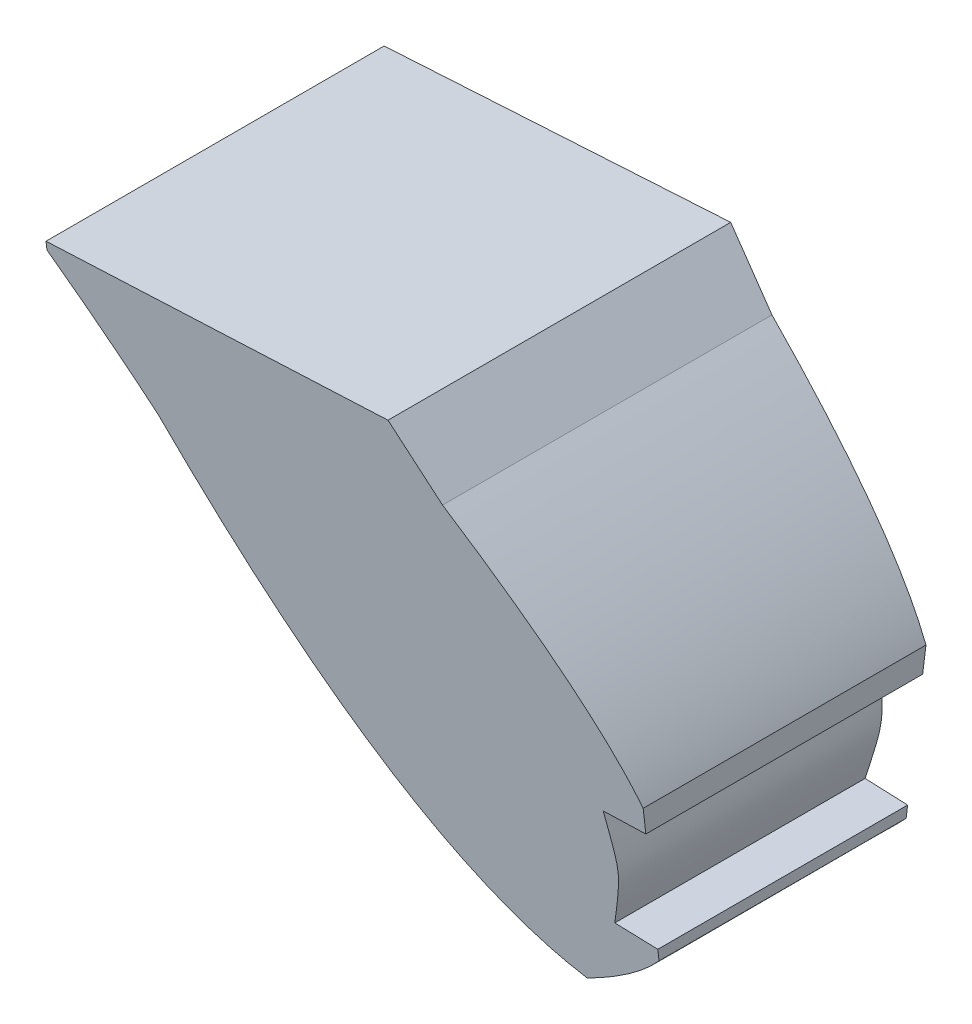
ISO-10303-21;
HEADER;
FILE_DESCRIPTION(('STEP AP214'),'2;1');
FILE_NAME('part.step','',(''),(''),'','','');
FILE_SCHEMA(('AUTOMOTIVE_DESIGN { 1 0 10303 214 1 1 1 1 }'));
ENDSEC;
DATA;
#1=APPLICATION_CONTEXT('core data for automotive mechanical design processes');
#2=APPLICATION_PROTOCOL_DEFINITION('international standard','automotive_design',2000,#1);
#3=PRODUCT_CONTEXT('',#1,'mechanical');
#4=PRODUCT('Part','Part','',(#3));
#5=PRODUCT_RELATED_PRODUCT_CATEGORY('part','',(#4));
#6=PRODUCT_DEFINITION_FORMATION('','',#4);
#7=PRODUCT_DEFINITION_CONTEXT('part definition',#1,'design');
#8=PRODUCT_DEFINITION('design','',#6,#7);
#9=PRODUCT_DEFINITION_SHAPE('','',#8);
#10=(LENGTH_UNIT() NAMED_UNIT(*) SI_UNIT(.MILLI.,.METRE.));
#11=(NAMED_UNIT(*) PLANE_ANGLE_UNIT() SI_UNIT($,.RADIAN.));
#12=(NAMED_UNIT(*) SI_UNIT($,.STERADIAN.) SOLID_ANGLE_UNIT());
#13=UNCERTAINTY_MEASURE_WITH_UNIT(LENGTH_MEASURE(1.E-05),#10,'distance_accuracy_value','');
#14=(GEOMETRIC_REPRESENTATION_CONTEXT(3) GLOBAL_UNCERTAINTY_ASSIGNED_CONTEXT((#13)) GLOBAL_UNIT_ASSIGNED_CONTEXT((#10,
#11,#12)) REPRESENTATION_CONTEXT('',''));
#15=CARTESIAN_POINT('',(0.,0.,0.));
#16=DIRECTION('',(0.,0.,1.));
#17=DIRECTION('',(1.,0.,0.));
#18=AXIS2_PLACEMENT_3D('',#15,#16,#17);
#19=CARTESIAN_POINT('',(0.355125000055651,-1.23774703808888E-13,7.));
#20=DIRECTION('',(-1.,3.48538412642003E-13,0.));
#21=DIRECTION('',(-3.48538412642003E-13,-1.,0.));
#22=AXIS2_PLACEMENT_3D('',#19,#20,#21);
#23=PLANE('',#22);
#24=DIRECTION('',(0.,-0.99013607461042,0.140109078060878));
#25=VECTOR('',#24,1.);
#26=CARTESIAN_POINT('',(0.355125000056697,12.6081551722012,-7.));
#27=LINE('',#26,#25);
#28=CARTESIAN_POINT('',(0.355125000056697,3.0015495286345,-5.64061850231631));
#29=VERTEX_POINT('',#28);
#30=CARTESIAN_POINT('',(0.355125000056447,2.03738091179555,-5.50418394603202));
#31=VERTEX_POINT('',#30);
#32=EDGE_CURVE('E56',#29,#31,#27,.T.);
#33=ORIENTED_EDGE('',*,*,#32,.F.);
#34=DIRECTION('',(0.,0.,-1.));
#35=VECTOR('',#34,1.);
#36=CARTESIAN_POINT('',(0.355125000056697,3.0015495286345,7.));
#37=LINE('',#36,#35);
#38=CARTESIAN_POINT('',(0.355125000056697,3.0015495286345,5.91249480185305));
#39=VERTEX_POINT('',#38);
#40=EDGE_CURVE('E177',#39,#29,#37,.T.);
#41=ORIENTED_EDGE('',*,*,#40,.F.);
#42=DIRECTION('',(0.,0.993653373689782,0.112485434412263));
#43=VECTOR('',#42,1.);
#44=CARTESIAN_POINT('',(0.355125000056697,12.6081551722012,7.));
#45=LINE('',#44,#43);
#46=CARTESIAN_POINT('',(0.355125000056697,2.03738091179556,5.80334715682562));
#47=VERTEX_POINT('',#46);
#48=EDGE_CURVE('E155',#47,#39,#45,.T.);
#49=ORIENTED_EDGE('',*,*,#48,.F.);
#50=DIRECTION('',(0.,0.,-1.));
#51=VECTOR('',#50,1.);
#52=CARTESIAN_POINT('',(0.355125000056447,2.03738091179555,7.));
#53=LINE('',#52,#51);
#54=EDGE_CURVE('E168',#47,#31,#53,.T.);
#55=ORIENTED_EDGE('',*,*,#54,.T.);
#56=EDGE_LOOP('',(#33,#41,#49,#55));
#57=FACE_BOUND('',#56,.T.);
#58=ADVANCED_FACE('F45',(#57),#23,.F.);
#59=CARTESIAN_POINT('',(-23.0359211456035,0.,7.));
#60=DIRECTION('',(-1.,0.,0.));
#61=DIRECTION('',(0.,0.,1.));
#62=AXIS2_PLACEMENT_3D('',#59,#60,#61);
#63=PLANE('',#62);
#64=DIRECTION('',(0.,0.,-1.));
#65=VECTOR('',#64,1.);
#66=CARTESIAN_POINT('',(-23.0359211456035,11.8716122879342,7.));
#67=LINE('',#66,#65);
#68=CARTESIAN_POINT('',(-23.0359211456035,11.8716122879342,6.91662047501294));
#69=VERTEX_POINT('',#68);
#70=CARTESIAN_POINT('',(-23.0359211456035,11.8716122879342,-6.89577559376618));
#71=VERTEX_POINT('',#70);
#72=EDGE_CURVE('E188',#69,#71,#67,.T.);
#73=ORIENTED_EDGE('',*,*,#72,.T.);
#74=DIRECTION('',(0.,-0.99013607461042,0.140109078060878));
#75=VECTOR('',#74,1.);
#76=CARTESIAN_POINT('',(-23.0359211456035,12.6081551722012,-7.));
#77=LINE('',#76,#75);
#78=CARTESIAN_POINT('',(-23.0359211456035,11.5401378200983,-6.84887034177091));
#79=VERTEX_POINT('',#78);
#80=EDGE_CURVE('E319',#71,#79,#77,.T.);
#81=ORIENTED_EDGE('',*,*,#80,.T.);
#82=DIRECTION('',(0.,0.,-1.));
#83=VECTOR('',#82,1.);
#84=CARTESIAN_POINT('',(-23.0359211456035,11.5401378200983,7.));
#85=LINE('',#84,#83);
#86=CARTESIAN_POINT('',(-23.0359211456035,11.5401378200983,6.87909627341673));
#87=VERTEX_POINT('',#86);
#88=EDGE_CURVE('E195',#87,#79,#85,.T.);
#89=ORIENTED_EDGE('',*,*,#88,.F.);
#90=DIRECTION('',(0.,0.993653373689782,0.112485434412263));
#91=VECTOR('',#90,1.);
#92=CARTESIAN_POINT('',(-23.0359211456035,12.6081551722012,7.));
#93=LINE('',#92,#91);
#94=EDGE_CURVE('E318',#87,#69,#93,.T.);
#95=ORIENTED_EDGE('',*,*,#94,.T.);
#96=EDGE_LOOP('',(#73,#81,#89,#95));
#97=FACE_BOUND('',#96,.T.);
#98=ADVANCED_FACE('F320',(#97),#63,.T.);
#99=CARTESIAN_POINT('',(-18.9451921135982,7.54091889574655,7.));
#100=CARTESIAN_POINT('',(-10.2150083842792,-3.69764410322756,7.));
#101=CARTESIAN_POINT('',(-2.84660482498738,-5.05908110388432,7.));
#102=(BOUNDED_CURVE() B_SPLINE_CURVE(2,(#99,#100,#101),.UNSPECIFIED.,.F.,
.F.) B_SPLINE_CURVE_WITH_KNOTS((3,3),(0.497667241108509,0.499554279588011),
.UNSPECIFIED.) CURVE() GEOMETRIC_REPRESENTATION_ITEM() RATIONAL_B_SPLINE_CURVE((1.,1.,1.)) REPRESENTATION_ITEM(''));
#103=DIRECTION('',(0.,0.,-1.));
#104=VECTOR('',#103,1.);
#105=SURFACE_OF_LINEAR_EXTRUSION('',#102,#104);
#106=DIRECTION('',(0.,0.,-1.));
#107=VECTOR('',#106,1.);
#108=CARTESIAN_POINT('',(-18.9451921135982,7.54091889574657,7.));
#109=LINE('',#108,#107);
#110=CARTESIAN_POINT('',(-18.9451921135982,7.54091889574657,6.42636910524442));
#111=VERTEX_POINT('',#110);
#112=CARTESIAN_POINT('',(-18.9451921135982,7.54091889574657,-6.28296138155552));
#113=VERTEX_POINT('',#112);
#114=EDGE_CURVE('E193',#111,#113,#109,.T.);
#115=ORIENTED_EDGE('',*,*,#114,.T.);
#116=CARTESIAN_POINT('',(-18.9451921135982,7.54091889574655,-6.28296138155552));
#117=CARTESIAN_POINT('',(-18.7038964519802,7.2303104897496,-6.23900877896065));
#118=CARTESIAN_POINT('',(-18.4603399822525,6.92141324766059,-6.19529831439479));
#119=CARTESIAN_POINT('',(-17.9682837978583,6.30732481853323,-6.10840181010699));
#120=CARTESIAN_POINT('',(-17.7197823475629,6.00213499551548,-6.06521596340061));
#121=CARTESIAN_POINT('',(-17.2175564674675,5.39593137881836,-5.979435198483));
#122=CARTESIAN_POINT('',(-16.963831414965,5.094918090265,-5.93684035174956));
#123=CARTESIAN_POINT('',(-16.4506402455859,4.49738208986369,-5.85228609676259));
#124=CARTESIAN_POINT('',(-16.191170459377,4.20086246455816,-5.81032712526984));
#125=CARTESIAN_POINT('',(-15.6662607518978,3.61309464996075,-5.72715511616038));
#126=CARTESIAN_POINT('',(-15.4008214235733,3.32184594225749,-5.68594200518594));
#127=CARTESIAN_POINT('',(-14.8635028735692,2.74525450942847,-5.60435150854307));
#128=CARTESIAN_POINT('',(-14.5916239867409,2.45991147865226,-5.56397407962363));
#129=CARTESIAN_POINT('',(-13.9877113876776,1.84139497055112,-5.47645098058941));
#130=CARTESIAN_POINT('',(-13.6542022410787,1.50962901587409,-5.42950448178613));
#131=CARTESIAN_POINT('',(-12.9763368636223,0.857149550246779,-5.3371754588095));
#132=CARTESIAN_POINT('',(-12.6319811525279,0.536435511230461,-5.29179285991224));
#133=CARTESIAN_POINT('',(-11.9306853751415,-0.0925968469944638,-5.20278171685694));
#134=CARTESIAN_POINT('',(-11.5737228139384,-0.40089066434875,-5.15915663983066));
#135=CARTESIAN_POINT('',(-10.846683961557,-1.0019670216422,-5.0741014070964));
#136=CARTESIAN_POINT('',(-10.47660810243,-1.29475007183177,-5.0326711791855));
#137=CARTESIAN_POINT('',(-9.71868281558909,-1.86428673565443,-4.95207896672475));
#138=CARTESIAN_POINT('',(-9.33070227812878,-2.14087020459772,-4.91294105847737));
#139=CARTESIAN_POINT('',(-8.53883813755209,-2.67108725040147,-4.83791276351402));
#140=CARTESIAN_POINT('',(-8.13495118895677,-2.92471596196101,-4.80202306526183));
#141=CARTESIAN_POINT('',(-7.3122365395161,-3.40271343039002,-4.73438409488761));
#142=CARTESIAN_POINT('',(-6.89348571927717,-3.6272108485399,-4.70261661656762));
#143=CARTESIAN_POINT('',(-6.03913983021939,-4.04182303955689,-4.64394697173213));
#144=CARTESIAN_POINT('',(-5.60355704189266,-4.2319623257252,-4.61704133646508));
#145=CARTESIAN_POINT('',(-4.78569097464129,-4.54380059377295,-4.57291470239869));
#146=CARTESIAN_POINT('',(-4.40579323869778,-4.6715597178509,-4.55483616395593));
#147=CARTESIAN_POINT('',(-3.82755348455618,-4.83729164366102,-4.53138428908141));
#148=CARTESIAN_POINT('',(-3.63298183043118,-4.88829916791852,-4.52416647591296));
#149=CARTESIAN_POINT('',(-3.24147540259105,-4.98091243837774,-4.51106124697222));
#150=CARTESIAN_POINT('',(-3.04453954058598,-5.02251366508979,-4.50517447072976));
#151=CARTESIAN_POINT('',(-2.84660482498738,-5.05908110388432,-4.5));
#152=B_SPLINE_CURVE_WITH_KNOTS('',3,(#116,#117,#118,#119,#120,#121,#122,#123,#124,#125,#126,
#127,#128,#129,#130,#131,#132,#133,#134,#135,#136,#137,#138,#139,#140,#141,#142,#143,#144,#145,
#146,#147,#148,#149,#150,#151),.UNSPECIFIED.,.F.,.F.,(4,2,2,2,2,2,2,2,2,2,2,2,2,2,2,2,2,4),(0.,
1.18730904988037,2.37504244995138,3.56291826839175,4.75157605308181,5.94011628711475,
7.12859485321423,8.54664144483177,9.96462018726616,11.3852714395501,12.8058759282812,
14.2394100098551,15.6732472233894,17.1005190111805,18.5267684358603,19.7288084895291,
20.3324222629634,20.9363254442573),.UNSPECIFIED.);
#153=CARTESIAN_POINT('',(-2.84660482498738,-5.05908110388432,-4.5));
#154=VERTEX_POINT('',#153);
#155=EDGE_CURVE('E254',#113,#154,#152,.T.);
#156=ORIENTED_EDGE('',*,*,#155,.T.);
#157=DIRECTION('',(0.,0.,-1.));
#158=VECTOR('',#157,1.);
#159=CARTESIAN_POINT('',(-2.84660482498738,-5.05908110388432,7.));
#160=LINE('',#159,#158);
#161=CARTESIAN_POINT('',(-2.84660482498738,-5.05908110388432,5.));
#162=VERTEX_POINT('',#161);
#163=EDGE_CURVE('E160',#162,#154,#160,.T.);
#164=ORIENTED_EDGE('',*,*,#163,.F.);
#165=CARTESIAN_POINT('',(-2.84660482498738,-5.05908110388432,5.));
#166=CARTESIAN_POINT('',(-3.0836355452615,-5.01529762547054,5.00495646039138));
#167=CARTESIAN_POINT('',(-3.31925014057108,-4.96428184629726,5.01073164541478));
#168=CARTESIAN_POINT('',(-3.78628189704186,-4.84911384389608,5.02376911212451));
#169=CARTESIAN_POINT('',(-4.01771143135529,-4.78501130060695,5.03102576984815));
#170=CARTESIAN_POINT('',(-4.47638324853452,-4.64477679089168,5.04690086287615));
#171=CARTESIAN_POINT('',(-4.70363211310207,-4.56866593727755,5.05551690812791));
#172=CARTESIAN_POINT('',(-5.15398016115681,-4.40545252874729,5.07399330205617));
#173=CARTESIAN_POINT('',(-5.37708095327682,-4.31835434125152,5.08385315632366));
#174=CARTESIAN_POINT('',(-5.81545834234536,-4.13567110279715,5.10453361087802));
#175=CARTESIAN_POINT('',(-6.03080317783365,-4.04024711994086,5.11533597762798));
#176=CARTESIAN_POINT('',(-6.45748946905634,-3.84057736608456,5.13793937192646));
#177=CARTESIAN_POINT('',(-6.66882789943329,-3.73632522989765,5.14974112003892));
#178=CARTESIAN_POINT('',(-7.08747417766979,-3.51983158147829,5.17424904476877));
#179=CARTESIAN_POINT('',(-7.29477947597257,-3.40758521204135,5.18695577124062));
#180=CARTESIAN_POINT('',(-7.70530843131035,-3.17590609220346,5.21318275051655));
#181=CARTESIAN_POINT('',(-7.90853147430462,-3.0564722713248,5.22670312450288));
#182=CARTESIAN_POINT('',(-8.45410340689061,-2.72385368196738,5.26435684511426));
#183=CARTESIAN_POINT('',(-8.79259906035209,-2.50440768840731,5.28919898682003));
#184=CARTESIAN_POINT('',(-9.45845448583479,-2.04949644973372,5.3406967119384));
#185=CARTESIAN_POINT('',(-9.78581359629267,-1.81403025542841,5.3673524028032));
#186=CARTESIAN_POINT('',(-10.4302582396863,-1.32938575303013,5.42221604925302));
#187=CARTESIAN_POINT('',(-10.7473396395034,-1.08020203459831,5.45042461730948));
#188=CARTESIAN_POINT('',(-11.3718438106499,-0.570176876647104,5.50816145288252));
#189=CARTESIAN_POINT('',(-11.6792662750814,-0.309335067346119,5.53768976225981));
#190=CARTESIAN_POINT('',(-12.2887351366992,0.225514030316342,5.59823676455314));
#191=CARTESIAN_POINT('',(-12.5906756597182,0.499640146613562,5.62926890925461));
#192=CARTESIAN_POINT('',(-13.1859914625247,1.05668157973797,5.69232817041119));
#193=CARTESIAN_POINT('',(-13.4793699933214,1.33959347409339,5.72435489942917));
#194=CARTESIAN_POINT('',(-14.0582984741035,1.91313890151101,5.78928247705987));
#195=CARTESIAN_POINT('',(-14.3438493181123,2.20377154523463,5.82218322499598));
#196=CARTESIAN_POINT('',(-14.9077244427009,2.7918210558895,5.88875272137508));
#197=CARTESIAN_POINT('',(-15.1860493084316,3.08923736980037,5.92242140721399));
#198=CARTESIAN_POINT('',(-15.7683607406539,3.72540309630891,5.99443784674841));
#199=CARTESIAN_POINT('',(-16.0715178451228,4.06490144250158,6.03287038264566));
#200=CARTESIAN_POINT('',(-16.6701836985208,4.7504922746204,6.11048193675692));
#201=CARTESIAN_POINT('',(-16.9656923307507,5.09658486102068,6.14966096634501));
#202=CARTESIAN_POINT('',(-17.4495199616275,5.67490501691598,6.21512906184765));
#203=CARTESIAN_POINT('',(-17.6398456690967,5.90547984199544,6.24123103065322));
#204=CARTESIAN_POINT('',(-18.0176052393411,6.36895711711416,6.29369846448112));
#205=CARTESIAN_POINT('',(-18.205039097963,6.60185957049552,6.3200639298818));
#206=CARTESIAN_POINT('',(-18.5771476687389,7.06981539005112,6.37303835239394));
#207=CARTESIAN_POINT('',(-18.7618224957771,7.30486866600559,6.39964729929217));
#208=CARTESIAN_POINT('',(-18.9451921135982,7.54091889574655,6.42636910524441));
#209=B_SPLINE_CURVE_WITH_KNOTS('',3,(#165,#166,#167,#168,#169,#170,#171,#172,#173,#174,#175,
#176,#177,#178,#179,#180,#181,#182,#183,#184,#185,#186,#187,#188,#189,#190,#191,#192,#193,#194,
#195,#196,#197,#198,#199,#200,#201,#202,#203,#204,#205,#206,#207,#208),.UNSPECIFIED.,.F.,.F.,(4,
2,2,2,2,2,2,2,2,2,2,2,2,2,2,2,2,2,2,2,2,4),(0.,0.723070627629283,1.44344574109941,
2.16256813451498,2.88140557514503,3.58855192345824,4.2962125448096,5.0043068623572,
5.71250690363926,6.92441762508089,8.13640021448464,9.3488642962315,10.5613668633146,
11.788141520998,13.0144441434254,14.2406061176645,15.4666684871313,16.8368576095009,
18.2070676256843,19.1073954524656,20.0077245721621,20.9080160976373),.UNSPECIFIED.);
#210=EDGE_CURVE('E137',#162,#111,#209,.T.);
#211=ORIENTED_EDGE('',*,*,#210,.T.);
#212=EDGE_LOOP('',(#115,#156,#164,#211));
#213=FACE_BOUND('',#212,.T.);
#214=ADVANCED_FACE('F42',(#213),#105,.F.);
#215=CARTESIAN_POINT('',(-2.84660482498738,-5.05908110388432,7.));
#216=CARTESIAN_POINT('',(-0.742366881974002,-3.93520659958673,7.));
#217=CARTESIAN_POINT('',(0.355124999965198,-2.72325322699678,7.));
#218=(BOUNDED_CURVE() B_SPLINE_CURVE(2,(#215,#216,#217),.UNSPECIFIED.,.F.,
.F.) B_SPLINE_CURVE_WITH_KNOTS((3,3),(0.498812074629495,0.499412845463797),
.UNSPECIFIED.) CURVE() GEOMETRIC_REPRESENTATION_ITEM() RATIONAL_B_SPLINE_CURVE((1.,1.,1.)) REPRESENTATION_ITEM(''));
#219=DIRECTION('',(0.,0.,-1.));
#220=VECTOR('',#219,1.);
#221=SURFACE_OF_LINEAR_EXTRUSION('',#218,#220);
#222=ORIENTED_EDGE('',*,*,#163,.T.);
#223=CARTESIAN_POINT('',(-2.84660482498738,-5.05908110388432,-4.5));
#224=CARTESIAN_POINT('',(-2.67168232131452,-4.96561684496857,-4.51322564795298));
#225=CARTESIAN_POINT('',(-2.49806669892658,-4.8696793272519,-4.52680127407489));
#226=CARTESIAN_POINT('',(-2.15391255522086,-4.67198313473111,-4.55477624840467));
#227=CARTESIAN_POINT('',(-1.98337896813819,-4.57021605500603,-4.56917678594981));
#228=CARTESIAN_POINT('',(-1.64633602392763,-4.36023460010958,-4.59889018475411));
#229=CARTESIAN_POINT('',(-1.47982758849725,-4.25201876756704,-4.6142032522384));
#230=CARTESIAN_POINT('',(-1.15202170484855,-4.0283472597601,-4.6458538602214));
#231=CARTESIAN_POINT('',(-0.990719882300239,-3.91289791497386,-4.66219050492663));
#232=CARTESIAN_POINT('',(-0.726338329593821,-3.71282188259136,-4.69050223819038));
#233=CARTESIAN_POINT('',(-0.621491729435474,-3.63048366206213,-4.70215349751053));
#234=CARTESIAN_POINT('',(-0.415267147982141,-3.46167192284429,-4.72604118098572));
#235=CARTESIAN_POINT('',(-0.313888615416795,-3.37519906666996,-4.73827751139176));
#236=CARTESIAN_POINT('',(-0.114933636786974,-3.19745214986019,-4.76342956602443));
#237=CARTESIAN_POINT('',(-0.0173696985143952,-3.10616428056932,-4.77634724424307));
#238=CARTESIAN_POINT('',(0.172820431917307,-2.91856566548536,-4.80289336217465));
#239=CARTESIAN_POINT('',(0.26544326687529,-2.82225159039899,-4.81652227299879));
#240=CARTESIAN_POINT('',(0.355124999965198,-2.72325322699678,-4.83053102369629));
#241=B_SPLINE_CURVE_WITH_KNOTS('',3,(#223,#224,#225,#226,#227,#228,#229,#230,#231,#232,#233,
#234,#235,#236,#237,#238,#239,#240),.UNSPECIFIED.,.F.,.F.,(4,2,2,2,2,2,2,2,4),(0.,
0.596335855249532,1.19355426064356,1.79090814869327,2.38774636766657,2.78911709207918,
3.19042371689264,3.59295145354013,3.99574928996896),.UNSPECIFIED.);
#242=CARTESIAN_POINT('',(0.355125000010947,-2.72325322699678,-4.83053102369629));
#243=VERTEX_POINT('',#242);
#244=EDGE_CURVE('E156',#154,#243,#241,.T.);
#245=ORIENTED_EDGE('',*,*,#244,.T.);
#246=DIRECTION('',(0.,0.,-1.));
#247=VECTOR('',#246,1.);
#248=CARTESIAN_POINT('',(0.355124999965198,-2.72325322699678,7.));
#249=LINE('',#248,#247);
#250=CARTESIAN_POINT('',(0.355125000010947,-2.72325322699678,5.26442481895704));
#251=VERTEX_POINT('',#250);
#252=EDGE_CURVE('E146',#251,#243,#249,.T.);
#253=ORIENTED_EDGE('',*,*,#252,.F.);
#254=CARTESIAN_POINT('',(0.355124999965198,-2.72325322699678,5.26442481895704));
#255=CARTESIAN_POINT('',(0.288265800066398,-2.79707578870119,5.25606781726749));
#256=CARTESIAN_POINT('',(0.219762299322532,-2.86939557158838,5.24788093599675));
#257=CARTESIAN_POINT('',(0.0798741499126208,-3.0111837154317,5.23182996553057));
#258=CARTESIAN_POINT('',(0.00849051694650469,-3.08065306448068,5.22396576447915));
#259=CARTESIAN_POINT('',(-0.209110404202349,-3.28478130911614,5.20085765164865));
#260=CARTESIAN_POINT('',(-0.359086186155244,-3.41549544786354,5.18606030171743));
#261=CARTESIAN_POINT('',(-0.666431647279958,-3.66745151891472,5.15753789253991));
#262=CARTESIAN_POINT('',(-0.823790135326829,-3.78870709059741,5.14381128926277));
#263=CARTESIAN_POINT('',(-1.14463764434189,-4.02329424679429,5.11725510893767));
#264=CARTESIAN_POINT('',(-1.30813354467851,-4.13661650521983,5.10442658763929));
#265=CARTESIAN_POINT('',(-1.58497175174893,-4.31986712055689,5.08368190381061));
#266=CARTESIAN_POINT('',(-1.69701528140079,-4.39175032218513,5.07554444523986));
#267=CARTESIAN_POINT('',(-1.92294333828473,-4.53261962763427,5.05959749086083));
#268=CARTESIAN_POINT('',(-2.03682799400811,-4.6016055280346,5.05178801808056));
#269=CARTESIAN_POINT('',(-2.26591352019373,-4.73675126913538,5.03648899349189));
#270=CARTESIAN_POINT('',(-2.38111062922232,-4.80291742324192,5.02899872698133));
#271=CARTESIAN_POINT('',(-2.6128736149529,-4.93278949726635,5.01429670205848));
#272=CARTESIAN_POINT('',(-2.72943923096306,-4.99649587614853,5.00708489168965));
#273=CARTESIAN_POINT('',(-2.84660482498738,-5.05908110388432,5.));
#274=B_SPLINE_CURVE_WITH_KNOTS('',3,(#254,#255,#256,#257,#258,#259,#260,#261,#262,#263,#264,
#265,#266,#267,#268,#269,#270,#271,#272,#273),.UNSPECIFIED.,.F.,.F.,(4,2,2,2,2,2,2,2,2,4),(0.,
0.299782926841572,0.599461041577767,1.1974499434567,1.79455995327913,2.39236050766276,
2.79242459253001,3.19251671924541,3.59166012626068,3.99072869445439),.UNSPECIFIED.);
#275=EDGE_CURVE('E128',#251,#162,#274,.T.);
#276=ORIENTED_EDGE('',*,*,#275,.T.);
#277=EDGE_LOOP('',(#222,#245,#253,#276));
#278=FACE_BOUND('',#277,.T.);
#279=ADVANCED_FACE('F154',(#278),#221,.F.);
#280=CARTESIAN_POINT('',(0.355125000532009,-7.39148800447813E-11,7.));
#281=DIRECTION('',(1.,-2.08137641489758E-10,0.));
#282=DIRECTION('',(2.08137641489758E-10,1.,0.));
#283=AXIS2_PLACEMENT_3D('',#280,#281,#282);
#284=PLANE('',#283);
#285=CARTESIAN_POINT('',(0.355125000056697,-2.28484178142546,-4.89256837899062));
#286=VERTEX_POINT('',#285);
#287=EDGE_CURVE('E151',#286,#243,#27,.T.);
#288=ORIENTED_EDGE('',*,*,#287,.F.);
#289=DIRECTION('',(0.,0.,-1.));
#290=VECTOR('',#289,1.);
#291=CARTESIAN_POINT('',(0.355125000056447,-2.28484178142545,7.));
#292=LINE('',#291,#290);
#293=CARTESIAN_POINT('',(0.355125000056697,-2.28484178142546,5.31405470319249));
#294=VERTEX_POINT('',#293);
#295=EDGE_CURVE('E147',#294,#286,#292,.T.);
#296=ORIENTED_EDGE('',*,*,#295,.F.);
#297=EDGE_CURVE('E132',#251,#294,#45,.T.);
#298=ORIENTED_EDGE('',*,*,#297,.F.);
#299=ORIENTED_EDGE('',*,*,#252,.T.);
#300=EDGE_LOOP('',(#288,#296,#298,#299));
#301=FACE_BOUND('',#300,.T.);
#302=ADVANCED_FACE('F150',(#301),#284,.T.);
#303=CARTESIAN_POINT('',(-0.0792587195419091,-2.26967276768239,7.));
#304=DIRECTION('',(-0.0348994967024901,-0.999390827019096,0.));
#305=DIRECTION('',(0.999390827019096,-0.0348994967024901,0.));
#306=AXIS2_PLACEMENT_3D('',#303,#304,#305);
#307=PLANE('',#306);
#308=ORIENTED_EDGE('',*,*,#295,.T.);
#309=DIRECTION('',(-0.999378640532074,0.0348990711409859,-0.00493838857923487));
#310=VECTOR('',#309,1.);
#311=CARTESIAN_POINT('',(-0.0205544945879303,-2.2717227643902,-4.89442478381114));
#312=LINE('',#311,#310);
#313=CARTESIAN_POINT('',(-1.39487499994356,-2.22373043481491,-4.90121593224337));
#314=VERTEX_POINT('',#313);
#315=EDGE_CURVE('E302',#286,#314,#312,.T.);
#316=ORIENTED_EDGE('',*,*,#315,.T.);
#317=DIRECTION('',(0.,0.,-1.));
#318=VECTOR('',#317,1.);
#319=CARTESIAN_POINT('',(-1.39487499994356,-2.22373043481491,7.));
#320=LINE('',#319,#318);
#321=CARTESIAN_POINT('',(-1.39487499994356,-2.22373043481491,5.3209727457947));
#322=VERTEX_POINT('',#321);
#323=EDGE_CURVE('E159',#322,#314,#320,.T.);
#324=ORIENTED_EDGE('',*,*,#323,.F.);
#325=DIRECTION('',(0.999383027616045,-0.034899224341334,-0.00395072820626436));
#326=VECTOR('',#325,1.);
#327=CARTESIAN_POINT('',(-0.0859085417339361,-2.26944055077446,5.31579818252456));
#328=LINE('',#327,#326);
#329=EDGE_CURVE('E323',#322,#294,#328,.T.);
#330=ORIENTED_EDGE('',*,*,#329,.T.);
#331=EDGE_LOOP('',(#308,#316,#324,#330));
#332=FACE_BOUND('',#331,.T.);
#333=ADVANCED_FACE('F331',(#332),#307,.F.);
#334=CARTESIAN_POINT('',(-1.39487499994356,-2.22373043481491,7.));
#335=CARTESIAN_POINT('',(-0.907530669798052,-0.123730434814926,7.));
#336=CARTESIAN_POINT('',(-1.39487499994356,1.976269565185,7.));
#337=(BOUNDED_CURVE() B_SPLINE_CURVE(2,(#334,#335,#336),.UNSPECIFIED.,.F.,
.F.) B_SPLINE_CURVE_WITH_KNOTS((3,3),(0.,1.),
.UNSPECIFIED.) CURVE() GEOMETRIC_REPRESENTATION_ITEM() RATIONAL_B_SPLINE_CURVE((1.,
3.23180121851367,1.)) REPRESENTATION_ITEM(''));
#338=DIRECTION('',(0.,0.,-1.));
#339=VECTOR('',#338,1.);
#340=SURFACE_OF_LINEAR_EXTRUSION('',#337,#339);
#341=ORIENTED_EDGE('',*,*,#323,.T.);
#342=CARTESIAN_POINT('',(-1.39487499994356,-2.22373043481491,-4.90121593224337));
#343=CARTESIAN_POINT('',(-1.38201998392506,-2.16833086849586,-4.90905524075961));
#344=CARTESIAN_POINT('',(-1.36920851501355,-2.11292133162427,-4.91689596015762));
#345=CARTESIAN_POINT('',(-1.3437018729633,-2.00207562961452,-4.93258116698306));
#346=CARTESIAN_POINT('',(-1.33100670062983,-1.94663946429477,-4.9404256544362));
#347=CARTESIAN_POINT('',(-1.30576205966111,-1.83573470622418,-4.95611921798194));
#348=CARTESIAN_POINT('',(-1.2932125907066,-1.78026611354467,-4.96396829406446));
#349=CARTESIAN_POINT('',(-1.26829754679368,-1.66926506738715,-4.97967548284358));
#350=CARTESIAN_POINT('',(-1.25593204756874,-1.61373259722297,-4.98753359790136));
#351=CARTESIAN_POINT('',(-1.23144959264176,-1.50261343133745,-5.00325750119742));
#352=CARTESIAN_POINT('',(-1.21933263872129,-1.44702673523042,-5.01112328949027));
#353=CARTESIAN_POINT('',(-1.19543476984433,-1.335780377245,-5.02686519108809));
#354=CARTESIAN_POINT('',(-1.18365386664772,-1.28012071288425,-5.03474130474432));
#355=CARTESIAN_POINT('',(-1.15478140365126,-1.14088412268467,-5.05444396055643));
#356=CARTESIAN_POINT('',(-1.13797627203471,-1.0572486083404,-5.06627879327125));
#357=CARTESIAN_POINT('',(-1.10608507159084,-0.889596396574636,-5.09000239796327));
#358=CARTESIAN_POINT('',(-1.09100001552513,-0.805579504561847,-5.10189119747609));
#359=CARTESIAN_POINT('',(-1.06832032888869,-0.664363501799818,-5.12187394980861));
#360=CARTESIAN_POINT('',(-1.05988274136069,-0.607299683279179,-5.12994875811888));
#361=CARTESIAN_POINT('',(-1.04510532762084,-0.492914147969679,-5.14613486860073));
#362=CARTESIAN_POINT('',(-1.03876488354033,-0.435592512193816,-5.15424615930859));
#363=CARTESIAN_POINT('',(-1.02899231393826,-0.320748634674586,-5.17049712744596));
#364=CARTESIAN_POINT('',(-1.02555742084765,-0.263226636350621,-5.17863677043044));
#365=CARTESIAN_POINT('',(-1.02221868148866,-0.148136104505515,-5.19492264135652));
#366=CARTESIAN_POINT('',(-1.02231110937053,-0.090567684313057,-5.20306885326154));
#367=CARTESIAN_POINT('',(-1.02599995323995,0.024498927510805,-5.21935133938808));
#368=CARTESIAN_POINT('',(-1.02959926184767,0.0819970219318673,-5.22748759985386));
#369=CARTESIAN_POINT('',(-1.03965558138725,0.196750700402388,-5.24372580438643));
#370=CARTESIAN_POINT('',(-1.04611338128298,0.254006213089817,-5.25182773835514));
#371=CARTESIAN_POINT('',(-1.06008401946836,0.360633933504864,-5.2669160802368));
#372=CARTESIAN_POINT('',(-1.0673416566876,0.410040106439022,-5.27390729439193));
#373=CARTESIAN_POINT('',(-1.08296388784332,0.508657939061929,-5.28786219813039));
#374=CARTESIAN_POINT('',(-1.09132803335532,0.557869669274236,-5.29482589769314));
#375=CARTESIAN_POINT('',(-1.10886347671322,0.656242217609038,-5.3087460925099));
#376=CARTESIAN_POINT('',(-1.11803620795756,0.705402782401002,-5.31570255191642));
#377=CARTESIAN_POINT('',(-1.13695432417189,0.803619871110158,-5.32960074843883));
#378=CARTESIAN_POINT('',(-1.14669976286484,0.852676384818173,-5.33654248411008));
#379=CARTESIAN_POINT('',(-1.1688545575114,0.961769653109906,-5.35197971302734));
#380=CARTESIAN_POINT('',(-1.18136868795827,1.02178546511503,-5.36047224279647));
#381=CARTESIAN_POINT('',(-1.20683341630284,1.14172468307228,-5.37744422642805));
#382=CARTESIAN_POINT('',(-1.21978400651105,1.20164809063296,-5.38592368051814));
#383=CARTESIAN_POINT('',(-1.24599979767988,1.32142766958967,-5.40287307445346));
#384=CARTESIAN_POINT('',(-1.25926500075588,1.38128384053078,-5.41134301423432));
#385=CARTESIAN_POINT('',(-1.28595889189158,1.5006374650995,-5.42823213354868));
#386=CARTESIAN_POINT('',(-1.29938638837972,1.56013518047528,-5.43665135012082));
#387=CARTESIAN_POINT('',(-1.32641467894809,1.67909098192554,-5.4534841755259));
#388=CARTESIAN_POINT('',(-1.34001547032681,1.73854906860263,-5.46189778444412));
#389=CARTESIAN_POINT('',(-1.36735267537614,1.85743174184853,-5.47872026185203));
#390=CARTESIAN_POINT('',(-1.38108908263848,1.91685632986131,-5.48712913054606));
#391=CARTESIAN_POINT('',(-1.39487499994356,1.976269565185,-5.49553639277927));
#392=B_SPLINE_CURVE_WITH_KNOTS('',3,(#342,#343,#344,#345,#346,#347,#348,#349,#350,#351,#352,
#353,#354,#355,#356,#357,#358,#359,#360,#361,#362,#363,#364,#365,#366,#367,#368,#369,#370,#371,
#372,#373,#374,#375,#376,#377,#378,#379,#380,#381,#382,#383,#384,#385,#386,#387,#388,#389,#390,
#391),.UNSPECIFIED.,.F.,.F.,(4,2,2,2,2,2,2,2,2,2,2,2,2,2,2,2,2,2,2,2,2,2,2,2,4),(0.,
0.172227726735398,0.344456645149337,0.516685186105837,0.688982767636586,0.861281583764008,
1.03358642200007,1.29195119997671,1.55046732325006,1.72518216889293,1.89984549341328,
2.07434226126798,2.24865471623176,2.42311107314076,2.5976156112955,2.74887022754415,
2.90006373293225,3.05153087024811,3.20301223872662,3.38868593830223,3.57435636841072,
3.76002804727593,3.94474488002245,4.129458836721,4.31416410650957),.UNSPECIFIED.);
#393=CARTESIAN_POINT('',(-1.39487499994356,1.976269565185,-5.49553639277928));
#394=VERTEX_POINT('',#393);
#395=EDGE_CURVE('E179',#314,#394,#392,.T.);
#396=ORIENTED_EDGE('',*,*,#395,.T.);
#397=DIRECTION('',(0.,0.,-1.));
#398=VECTOR('',#397,1.);
#399=CARTESIAN_POINT('',(-1.39487499994356,1.976269565185,7.));
#400=LINE('',#399,#398);
#401=CARTESIAN_POINT('',(-1.39487499994356,1.976269565185,5.79642911422342));
#402=VERTEX_POINT('',#401);
#403=EDGE_CURVE('E169',#402,#394,#400,.T.);
#404=ORIENTED_EDGE('',*,*,#403,.F.);
#405=CARTESIAN_POINT('',(-1.39487499994356,1.976269565185,5.79642911422342));
#406=CARTESIAN_POINT('',(-1.37907511533365,1.90817072448153,5.78872006005792));
#407=CARTESIAN_POINT('',(-1.36333836969219,1.84005724657732,5.78100934890426));
#408=CARTESIAN_POINT('',(-1.33204781411177,1.703774616767,5.76558162408294));
#409=CARTESIAN_POINT('',(-1.31649404111311,1.63560545649229,5.75786460946793));
#410=CARTESIAN_POINT('',(-1.28563112684324,1.49920642241426,5.74242370722985));
#411=CARTESIAN_POINT('',(-1.27032200601989,1.43097654403409,5.73469981908867));
#412=CARTESIAN_POINT('',(-1.2399275173513,1.29390485970128,5.71918277022027));
#413=CARTESIAN_POINT('',(-1.22484485449072,1.22506245970345,5.71138954224482));
#414=CARTESIAN_POINT('',(-1.19518112320204,1.0872751663326,5.69579148364441));
#415=CARTESIAN_POINT('',(-1.18060002365467,1.01833027959621,5.68798665377074));
#416=CARTESIAN_POINT('',(-1.1521828568661,0.880291295746957,5.67236010282727));
#417=CARTESIAN_POINT('',(-1.13834675067045,0.81119720663251,5.66453838266293));
#418=CARTESIAN_POINT('',(-1.11516473949854,0.690174385789182,5.65083812768789));
#419=CARTESIAN_POINT('',(-1.10556404533104,0.638294159941606,5.64496508393199));
#420=CARTESIAN_POINT('',(-1.08728934318226,0.534373551286744,5.6332008660282));
#421=CARTESIAN_POINT('',(-1.07861528667302,0.482333177013413,5.62730969284637));
#422=CARTESIAN_POINT('',(-1.06260440200736,0.378149691610768,5.61551571627023));
#423=CARTESIAN_POINT('',(-1.05526500549272,0.326006977236309,5.60961295779011));
#424=CARTESIAN_POINT('',(-1.04244257361275,0.221494061638693,5.59778168843203));
#425=CARTESIAN_POINT('',(-1.03695934618146,0.169123884520429,5.59185318028283));
#426=CARTESIAN_POINT('',(-1.02917052981484,0.0729301509045448,5.58096367474698));
#427=CARTESIAN_POINT('',(-1.02648754730517,0.0291375389214666,5.57600618039996));
#428=CARTESIAN_POINT('',(-1.02311803398459,-0.0585228047861236,5.56608268785843));
#429=CARTESIAN_POINT('',(-1.02243133042271,-0.10239052968188,5.56111669043696));
#430=CARTESIAN_POINT('',(-1.02313587995194,-0.190112899664059,5.55118617627941));
#431=CARTESIAN_POINT('',(-1.02452732528276,-0.233967543165022,5.54622165972282));
#432=CARTESIAN_POINT('',(-1.02922830316647,-0.321575626235211,5.53630408328911));
#433=CARTESIAN_POINT('',(-1.03253802615093,-0.365329055323649,5.53135102459847));
#434=CARTESIAN_POINT('',(-1.04481913269156,-0.496026010219698,5.51655561994619));
#435=CARTESIAN_POINT('',(-1.05614963950478,-0.582745183351363,5.50673867158183));
#436=CARTESIAN_POINT('',(-1.08246686740171,-0.755641929816293,5.48716608606103));
#437=CARTESIAN_POINT('',(-1.09745579058543,-0.84181914476287,5.47741048947536));
#438=CARTESIAN_POINT('',(-1.129420439335,-1.01366509487317,5.45795685819712));
#439=CARTESIAN_POINT('',(-1.14639302616418,-1.09933441387988,5.44825875741124));
#440=CARTESIAN_POINT('',(-1.18149622255001,-1.27039766561497,5.42889373063944));
#441=CARTESIAN_POINT('',(-1.19962634896168,-1.35579169781193,5.41922679339328));
#442=CARTESIAN_POINT('',(-1.24641099322308,-1.57177275123237,5.39477689641502));
#443=CARTESIAN_POINT('',(-1.2755379218154,-1.70225834502177,5.38000541866374));
#444=CARTESIAN_POINT('',(-1.31987060164556,-1.89787014932725,5.35786140006925));
#445=CARTESIAN_POINT('',(-1.33475842772637,-1.96306843680887,5.35048069983263));
#446=CARTESIAN_POINT('',(-1.36470186719661,-2.09342597092531,5.33572371893541));
#447=CARTESIAN_POINT('',(-1.37975747811874,-2.15858521811941,5.32834743821149));
#448=CARTESIAN_POINT('',(-1.39487499994356,-2.22373043481491,5.3209727457947));
#449=B_SPLINE_CURVE_WITH_KNOTS('',3,(#405,#406,#407,#408,#409,#410,#411,#412,#413,#414,#415,
#416,#417,#418,#419,#420,#421,#422,#423,#424,#425,#426,#427,#428,#429,#430,#431,#432,#433,#434,
#435,#436,#437,#438,#439,#440,#441,#442,#443,#444,#445,#446,#447,#448),.UNSPECIFIED.,.F.,.F.,(4,
2,2,2,2,2,2,2,2,2,2,2,2,2,2,2,2,2,2,2,2,4),(0.,0.210994688118994,0.422031267037357,
0.633085392962154,0.845798629208893,1.05849864386888,1.27118752598179,1.4304428147189,
1.58968975917224,1.7486269361582,1.90754766218714,2.03996993828288,2.1723807546786,
2.30480382052941,2.43724003455642,2.70109168787962,2.96510255404672,3.22870119353187,
3.49219051999256,3.89571487778355,4.09756249770236,4.29940715332609),.UNSPECIFIED.);
#450=EDGE_CURVE('E68',#402,#322,#449,.T.);
#451=ORIENTED_EDGE('',*,*,#450,.T.);
#452=EDGE_LOOP('',(#341,#396,#404,#451));
#453=FACE_BOUND('',#452,.T.);
#454=ADVANCED_FACE('F174',(#453),#340,.F.);
#455=CARTESIAN_POINT('',(0.355125000056697,3.0015495286345,7.));
#456=CARTESIAN_POINT('',(-1.44872627004384,6.0584273141466,7.));
#457=CARTESIAN_POINT('',(-6.99487502582887,10.4773899922143,7.));
#458=(BOUNDED_CURVE() B_SPLINE_CURVE(2,(#455,#456,#457),.UNSPECIFIED.,.F.,
.F.) B_SPLINE_CURVE_WITH_KNOTS((3,3),(0.500820705122982,0.502013311782223),
.UNSPECIFIED.) CURVE() GEOMETRIC_REPRESENTATION_ITEM() RATIONAL_B_SPLINE_CURVE((1.,1.,1.)) REPRESENTATION_ITEM(''));
#459=DIRECTION('',(0.,0.,-1.));
#460=VECTOR('',#459,1.);
#461=SURFACE_OF_LINEAR_EXTRUSION('',#458,#460);
#462=ORIENTED_EDGE('',*,*,#40,.T.);
#463=CARTESIAN_POINT('',(0.355125000056697,3.0015495286345,-5.64061850231631));
#464=CARTESIAN_POINT('',(0.304748939083955,3.08690693737855,-5.65269699147701));
#465=CARTESIAN_POINT('',(0.253108225429002,3.17152038942491,-5.66467020714075));
#466=CARTESIAN_POINT('',(0.14756477543284,3.33933655217308,-5.68841701169548));
#467=CARTESIAN_POINT('',(0.0936623787202055,3.42253947207331,-5.70019063018906));
#468=CARTESIAN_POINT('',(-0.0708601071334783,3.66988593967605,-5.73519136031706));
#469=CARTESIAN_POINT('',(-0.184480548399911,3.83207687413754,-5.75814216766561));
#470=CARTESIAN_POINT('',(-0.418098458248837,4.15176411100976,-5.80337946905736));
#471=CARTESIAN_POINT('',(-0.538093545823617,4.30926213244506,-5.82566620635091));
#472=CARTESIAN_POINT('',(-0.78283818804409,4.61950774280896,-5.86956747159632));
#473=CARTESIAN_POINT('',(-0.907565419883573,4.77227264606429,-5.89118444960976));
#474=CARTESIAN_POINT('',(-1.16143936450042,5.07425586652761,-5.93391654643354));
#475=CARTESIAN_POINT('',(-1.29058790904241,5.22347266927897,-5.95503145094089));
#476=CARTESIAN_POINT('',(-1.55260609149836,5.51869701015613,-5.99680713337697));
#477=CARTESIAN_POINT('',(-1.68547623219015,5.66470410985742,-6.0174678492665));
#478=CARTESIAN_POINT('',(-1.95129246731504,5.95047883834213,-6.05790636551473));
#479=CARTESIAN_POINT('',(-2.08416607241,6.09031270147858,-6.07769353835705));
#480=CARTESIAN_POINT('',(-2.35252937546219,6.36744476147034,-6.11690907491027));
#481=CARTESIAN_POINT('',(-2.48801859110257,6.50474341685106,-6.13633750350476));
#482=CARTESIAN_POINT('',(-2.76131016277586,6.77705079882383,-6.17487032461461));
#483=CARTESIAN_POINT('',(-2.89911242310222,6.91205961969962,-6.19397473047159));
#484=CARTESIAN_POINT('',(-3.17702453011853,7.1802334282759,-6.23192263080891));
#485=CARTESIAN_POINT('',(-3.31713813468433,7.31339459419485,-6.25076558448854));
#486=CARTESIAN_POINT('',(-3.59920942217068,7.57779672452424,-6.28817977397997));
#487=CARTESIAN_POINT('',(-3.74116717214814,7.70903761873863,-6.30675099985869));
#488=CARTESIAN_POINT('',(-4.02673570619447,7.96974588066472,-6.34364248897618));
#489=CARTESIAN_POINT('',(-4.17034650743124,8.09921322992649,-6.3619627496042));
#490=CARTESIAN_POINT('',(-4.4600293139236,8.35736925950923,-6.39849308541176));
#491=CARTESIAN_POINT('',(-4.60611137003211,8.48604687580305,-6.41670159497756));
#492=CARTESIAN_POINT('',(-4.89964583477598,8.74185547826847,-6.45289975841238));
#493=CARTESIAN_POINT('',(-5.04709822405376,8.86898648622936,-6.4708894153647));
#494=CARTESIAN_POINT('',(-5.34325591792383,9.12181123810467,-6.50666534940504));
#495=CARTESIAN_POINT('',(-5.49196123236593,9.24750497070168,-6.52445162489159));
#496=CARTESIAN_POINT('',(-5.79006878025452,9.49717224563451,-6.55978076056274));
#497=CARTESIAN_POINT('',(-5.93946756063865,9.62114983181206,-6.57732419297064));
#498=CARTESIAN_POINT('',(-6.23931193554178,9.86785345288031,-6.61223395718234));
#499=CARTESIAN_POINT('',(-6.38975751771416,9.99057950249044,-6.62960029106902));
#500=CARTESIAN_POINT('',(-6.69161176589484,10.2348504069263,-6.66416581402613));
#501=CARTESIAN_POINT('',(-6.84302038525678,10.3563953182525,-6.68136501109164));
#502=CARTESIAN_POINT('',(-6.99487502582887,10.4773899922143,-6.69848634688959));
#503=B_SPLINE_CURVE_WITH_KNOTS('',3,(#463,#464,#465,#466,#467,#468,#469,#470,#471,#472,#473,
#474,#475,#476,#477,#478,#479,#480,#481,#482,#483,#484,#485,#486,#487,#488,#489,#490,#491,#492,
#493,#494,#495,#496,#497,#498,#499,#500,#501,#502),.UNSPECIFIED.,.F.,.F.,(4,2,2,2,2,2,2,2,2,2,2,
2,2,2,2,2,2,2,2,4),(0.,0.29951474795604,0.598984678740554,1.19683557119437,1.79446470799431,
2.38955920955045,2.98490331765387,3.5803282468477,4.16201477674594,4.74359504966435,
5.32515131764568,5.90777069814833,6.49041132351631,7.07305800541613,7.65961656351232,
8.24616684832698,8.83272174858912,9.41750815388469,10.0022876735038,10.5870390807997),.UNSPECIFIED.);
#504=CARTESIAN_POINT('',(-6.99487502582887,10.4773899922143,-6.69848634688959));
#505=VERTEX_POINT('',#504);
#506=EDGE_CURVE('E229',#29,#505,#503,.T.);
#507=ORIENTED_EDGE('',*,*,#506,.T.);
#508=DIRECTION('',(0.,0.,-1.));
#509=VECTOR('',#508,1.);
#510=CARTESIAN_POINT('',(-6.99487502582887,10.4773899922143,7.));
#511=LINE('',#510,#509);
#512=CARTESIAN_POINT('',(-6.99487502582887,10.4773899922143,6.75878907751167));
#513=VERTEX_POINT('',#512);
#514=EDGE_CURVE('E182',#513,#505,#511,.T.);
#515=ORIENTED_EDGE('',*,*,#514,.F.);
#516=CARTESIAN_POINT('',(-6.99487502582887,10.4773899922143,6.75878907751167));
#517=CARTESIAN_POINT('',(-6.8413729328842,10.3550825633836,6.74494339990603));
#518=CARTESIAN_POINT('',(-6.68832454473299,10.2322113968793,6.73103390499871));
#519=CARTESIAN_POINT('',(-6.38320800729791,9.98525754721245,6.70307776677679));
#520=CARTESIAN_POINT('',(-6.23113990898295,9.86117480188558,6.68903111642493));
#521=CARTESIAN_POINT('',(-5.92807065524143,9.61172472707623,6.66079239578847));
#522=CARTESIAN_POINT('',(-5.77706951376426,9.4863573808512,6.64660032360854));
#523=CARTESIAN_POINT('',(-5.47576586823065,9.23386151969447,6.61801680808739));
#524=CARTESIAN_POINT('',(-5.32546696630186,9.10672875882622,6.60362488408959));
#525=CARTESIAN_POINT('',(-5.02614983518305,8.85098522990144,6.57467371992013));
#526=CARTESIAN_POINT('',(-4.87713159456568,8.72237447505705,6.56011448124413));
#527=CARTESIAN_POINT('',(-4.58049768691917,8.4635608439173,6.53081576953901));
#528=CARTESIAN_POINT('',(-4.43288203846827,8.33335794658506,6.51607629412843));
#529=CARTESIAN_POINT('',(-4.14210139347426,8.07382538694137,6.48669619691481));
#530=CARTESIAN_POINT('',(-3.99890608102053,7.94452928138955,6.47205937386774));
#531=CARTESIAN_POINT('',(-3.71416611319349,7.68415632984108,6.44258414101528));
#532=CARTESIAN_POINT('',(-3.57262144073419,7.55307950230738,6.42774573329996));
#533=CARTESIAN_POINT('',(-3.29137414395358,7.28899712986201,6.39785057954546));
#534=CARTESIAN_POINT('',(-3.1516714542651,7.15599165374669,6.38279384129429));
#535=CARTESIAN_POINT('',(-2.87458175917985,6.88812206371671,6.35246995974949));
#536=CARTESIAN_POINT('',(-2.73719095714564,6.75326183141828,6.33720325586995));
#537=CARTESIAN_POINT('',(-2.4647217040658,6.4812406817504,6.30640940159449));
#538=CARTESIAN_POINT('',(-2.3296433470098,6.344079671312,6.29088224066282));
#539=CARTESIAN_POINT('',(-2.06210260883396,6.06721026914355,6.25953954530947));
#540=CARTESIAN_POINT('',(-1.92964070354025,5.92750142279085,6.24372395942274));
#541=CARTESIAN_POINT('',(-1.66562238661239,5.64300124412993,6.21151743043145));
#542=CARTESIAN_POINT('',(-1.53411576395753,5.49816420330923,6.19512131294513));
#543=CARTESIAN_POINT('',(-1.27477241827144,5.20530942617557,6.1619690108468));
#544=CARTESIAN_POINT('',(-1.146935201756,5.05729212228994,6.14521287518726));
#545=CARTESIAN_POINT('',(-0.895619086203261,4.75774147994064,6.11130257505109));
#546=CARTESIAN_POINT('',(-0.772138401037261,4.60620962564755,6.09414857858836));
#547=CARTESIAN_POINT('',(-0.529814215553586,4.29847884173296,6.05931225454699));
#548=CARTESIAN_POINT('',(-0.410992610293168,4.14226283985584,6.04162799432248));
#549=CARTESIAN_POINT('',(-0.179619110055476,3.82518978007974,6.00573408824445));
#550=CARTESIAN_POINT('',(-0.0670695368194355,3.66433103656916,5.98752425157313));
#551=CARTESIAN_POINT('',(0.0959476258682439,3.41902899751658,5.95975510475025));
#552=CARTESIAN_POINT('',(0.149364159232856,3.33651676897211,5.95041439890865));
#553=CARTESIAN_POINT('',(0.253976160624149,3.17009812823874,5.93157516020342));
#554=CARTESIAN_POINT('',(0.305171300426591,3.0861915125367,5.92207660430132));
#555=CARTESIAN_POINT('',(0.355125000056697,3.0015495286345,5.91249480185305));
#556=B_SPLINE_CURVE_WITH_KNOTS('',3,(#516,#517,#518,#519,#520,#521,#522,#523,#524,#525,#526,
#527,#528,#529,#530,#531,#532,#533,#534,#535,#536,#537,#538,#539,#540,#541,#542,#543,#544,#545,
#546,#547,#548,#549,#550,#551,#552,#553,#554,#555),.UNSPECIFIED.,.F.,.F.,(4,2,2,2,2,2,2,2,2,2,2,
2,2,2,2,2,2,2,2,4),(0.,0.590274012205936,1.18057847133787,1.77089063387541,2.36302742672822,
2.95515893044104,3.54729826641976,4.12774064799354,4.70817701598977,5.28859273006671,
5.86793765731305,6.4473060764699,7.02677890672858,7.61567889581169,8.20449931137601,
8.79307544349984,9.38414853693651,9.97543899618637,10.2716165714927,10.5678377608222),.UNSPECIFIED.);
#557=EDGE_CURVE('E222',#513,#39,#556,.T.);
#558=ORIENTED_EDGE('',*,*,#557,.T.);
#559=EDGE_LOOP('',(#462,#507,#515,#558));
#560=FACE_BOUND('',#559,.T.);
#561=ADVANCED_FACE('F209',(#560),#461,.F.);
#562=CARTESIAN_POINT('',(1.48452736456058,1.38434415860098,7.));
#563=DIRECTION('',(0.731353702758341,0.681998358840887,0.));
#564=DIRECTION('',(-0.681998358840887,0.731353702758341,0.));
#565=AXIS2_PLACEMENT_3D('',#562,#563,#564);
#566=PLANE('',#565);
#567=DIRECTION('',(0.678375265538954,-0.727468410854836,0.102940324039185));
#568=VECTOR('',#567,1.);
#569=CARTESIAN_POINT('',(2.35126861638903,0.454877957339886,-5.28025206872452));
#570=LINE('',#569,#568);
#571=CARTESIAN_POINT('',(-8.98184569453097,12.6081551722012,-6.99999999999999));
#572=VERTEX_POINT('',#571);
#573=EDGE_CURVE('E239',#572,#505,#570,.T.);
#574=ORIENTED_EDGE('',*,*,#573,.F.);
#575=DIRECTION('',(0.,0.,-1.));
#576=VECTOR('',#575,1.);
#577=CARTESIAN_POINT('',(-8.98184569452943,12.6081551722012,7.));
#578=LINE('',#577,#576);
#579=CARTESIAN_POINT('',(-8.98184569452943,12.6081551722012,7.));
#580=VERTEX_POINT('',#579);
#581=EDGE_CURVE('E186',#580,#572,#578,.T.);
#582=ORIENTED_EDGE('',*,*,#581,.F.);
#583=DIRECTION('',(-0.679672917760627,0.728859972498513,0.0825097894326689));
#584=VECTOR('',#583,1.);
#585=CARTESIAN_POINT('',(1.41327370604816,1.46075435272037,5.73807078308337));
#586=LINE('',#585,#584);
#587=EDGE_CURVE('E296',#513,#580,#586,.T.);
#588=ORIENTED_EDGE('',*,*,#587,.F.);
#589=ORIENTED_EDGE('',*,*,#514,.T.);
#590=EDGE_LOOP('',(#574,#582,#588,#589));
#591=FACE_BOUND('',#590,.T.);
#592=ADVANCED_FACE('F214',(#591),#566,.T.);
#593=CARTESIAN_POINT('',(-0.683557287645435,13.0430500394562,7.));
#594=DIRECTION('',(0.0523359562429403,-0.998629534754574,0.));
#595=DIRECTION('',(0.998629534754574,0.0523359562429404,0.));
#596=AXIS2_PLACEMENT_3D('',#593,#594,#595);
#597=PLANE('',#596);
#598=ORIENTED_EDGE('',*,*,#581,.T.);
#599=DIRECTION('',(-0.998602150579861,-0.0523345210991561,0.00740558968608979));
#600=VECTOR('',#599,1.);
#601=CARTESIAN_POINT('',(-0.787545717689094,13.0376002367664,-7.06076856870174));
#602=LINE('',#601,#600);
#603=EDGE_CURVE('E266',#572,#71,#602,.T.);
#604=ORIENTED_EDGE('',*,*,#603,.T.);
#605=ORIENTED_EDGE('',*,*,#72,.F.);
#606=DIRECTION('',(0.998612008623237,0.0523350377373175,0.00592453023432517));
#607=VECTOR('',#606,1.);
#608=CARTESIAN_POINT('',(-0.683848558053945,13.0430347746209,7.04923006582624));
#609=LINE('',#608,#607);
#610=EDGE_CURVE('E143',#69,#580,#609,.T.);
#611=ORIENTED_EDGE('',*,*,#610,.T.);
#612=EDGE_LOOP('',(#598,#604,#605,#611));
#613=FACE_BOUND('',#612,.T.);
#614=ADVANCED_FACE('F348',(#613),#597,.F.);
#615=CARTESIAN_POINT('',(-69.8841339427642,-40.4718315495759,7.));
#616=DIRECTION('',(0.,0.,-1.));
#617=DIRECTION('',(-1.,0.,0.));
#618=AXIS2_PLACEMENT_3D('',#615,#616,#617);
#619=CYLINDRICAL_SURFACE('',#618,69.9999999999998);
#620=CARTESIAN_POINT('',(-69.8841339427642,-40.4718315495759,0.511076703268311));
#621=DIRECTION('',(0.,0.140109078060878,0.99013607461042));
#622=DIRECTION('',(0.,0.99013607461042,-0.140109078060878));
#623=AXIS2_PLACEMENT_3D('',#620,#621,#622);
#624=ELLIPSE('',#623,70.6973534193693,69.9999999999998);
#625=EDGE_CURVE('E304',#113,#79,#624,.T.);
#626=ORIENTED_EDGE('',*,*,#625,.F.);
#627=ORIENTED_EDGE('',*,*,#114,.F.);
#628=CARTESIAN_POINT('',(-69.8841339427642,-40.4718315495759,0.991138637385349));
#629=DIRECTION('',(0.,0.112485434412263,-0.993653373689781));
#630=DIRECTION('',(0.,-0.993653373689782,-0.112485434412263));
#631=AXIS2_PLACEMENT_3D('',#628,#629,#630);
#632=ELLIPSE('',#631,70.4471014273976,69.9999999999998);
#633=EDGE_CURVE('E314',#87,#111,#632,.T.);
#634=ORIENTED_EDGE('',*,*,#633,.F.);
#635=ORIENTED_EDGE('',*,*,#88,.T.);
#636=EDGE_LOOP('',(#626,#627,#634,#635));
#637=FACE_BOUND('',#636,.T.);
#638=ADVANCED_FACE('F313',(#637),#619,.F.);
#639=CARTESIAN_POINT('',(-1.39487499994356,1.976269565185,7.));
#640=DIRECTION('',(-0.0348994967024943,0.999390827019096,0.));
#641=DIRECTION('',(-0.999390827019096,-0.0348994967024943,0.));
#642=AXIS2_PLACEMENT_3D('',#639,#640,#641);
#643=PLANE('',#642);
#644=ORIENTED_EDGE('',*,*,#403,.T.);
#645=DIRECTION('',(0.999378640532074,0.0348990711409901,-0.00493838857923546));
#646=VECTOR('',#645,1.);
#647=CARTESIAN_POINT('',(-1.45654447142248,1.97411601978681,-5.49523165561431));
#648=LINE('',#647,#646);
#649=EDGE_CURVE('E11',#394,#31,#648,.T.);
#650=ORIENTED_EDGE('',*,*,#649,.T.);
#651=ORIENTED_EDGE('',*,*,#54,.F.);
#652=DIRECTION('',(-0.999383027616045,-0.0348992243413382,-0.00395072820626483));
#653=VECTOR('',#652,1.);
#654=CARTESIAN_POINT('',(-1.39012295218912,1.97643551034925,5.79644789986274));
#655=LINE('',#654,#653);
#656=EDGE_CURVE('E55',#47,#402,#655,.T.);
#657=ORIENTED_EDGE('',*,*,#656,.T.);
#658=EDGE_LOOP('',(#644,#650,#651,#657));
#659=FACE_BOUND('',#658,.T.);
#660=ADVANCED_FACE('F170',(#659),#643,.F.);
#661=CARTESIAN_POINT('',(-23.0359211456035,12.6081551722012,7.));
#662=DIRECTION('',(0.,0.112485434412263,-0.993653373689781));
#663=DIRECTION('',(0.,0.993653373689782,0.112485434412263));
#664=AXIS2_PLACEMENT_3D('',#661,#662,#663);
#665=PLANE('',#664);
#666=ORIENTED_EDGE('',*,*,#587,.T.);
#667=ORIENTED_EDGE('',*,*,#610,.F.);
#668=ORIENTED_EDGE('',*,*,#94,.F.);
#669=ORIENTED_EDGE('',*,*,#633,.T.);
#670=ORIENTED_EDGE('',*,*,#210,.F.);
#671=ORIENTED_EDGE('',*,*,#275,.F.);
#672=ORIENTED_EDGE('',*,*,#297,.T.);
#673=ORIENTED_EDGE('',*,*,#329,.F.);
#674=ORIENTED_EDGE('',*,*,#450,.F.);
#675=ORIENTED_EDGE('',*,*,#656,.F.);
#676=ORIENTED_EDGE('',*,*,#48,.T.);
#677=ORIENTED_EDGE('',*,*,#557,.F.);
#678=EDGE_LOOP('',(#666,#667,#668,#669,#670,#671,#672,#673,#674,#675,#676,#677));
#679=FACE_BOUND('',#678,.T.);
#680=ADVANCED_FACE('F135',(#679),#665,.F.);
#681=CARTESIAN_POINT('',(-23.0359211456035,12.6081551722012,-7.));
#682=DIRECTION('',(0.,0.140109078060878,0.99013607461042));
#683=DIRECTION('',(0.,-0.99013607461042,0.140109078060878));
#684=AXIS2_PLACEMENT_3D('',#681,#682,#683);
#685=PLANE('',#684);
#686=ORIENTED_EDGE('',*,*,#32,.T.);
#687=ORIENTED_EDGE('',*,*,#649,.F.);
#688=ORIENTED_EDGE('',*,*,#395,.F.);
#689=ORIENTED_EDGE('',*,*,#315,.F.);
#690=ORIENTED_EDGE('',*,*,#287,.T.);
#691=ORIENTED_EDGE('',*,*,#244,.F.);
#692=ORIENTED_EDGE('',*,*,#155,.F.);
#693=ORIENTED_EDGE('',*,*,#625,.T.);
#694=ORIENTED_EDGE('',*,*,#80,.F.);
#695=ORIENTED_EDGE('',*,*,#603,.F.);
#696=ORIENTED_EDGE('',*,*,#573,.T.);
#697=ORIENTED_EDGE('',*,*,#506,.F.);
#698=EDGE_LOOP('',(#686,#687,#688,#689,#690,#691,#692,#693,#694,#695,#696,#697));
#699=FACE_BOUND('',#698,.T.);
#700=ADVANCED_FACE('F241',(#699),#685,.F.);
#701=CLOSED_SHELL('',(#58,#98,#214,#279,#302,#333,#454,#561,#592,#614,#638,#660,#680,#700));
#702=MANIFOLD_SOLID_BREP('B2',#701);
#703=ADVANCED_BREP_SHAPE_REPRESENTATION('',(#18,#702),#14);
#704=SHAPE_DEFINITION_REPRESENTATION(#9,#703);
ENDSEC;
END-ISO-10303-21;
